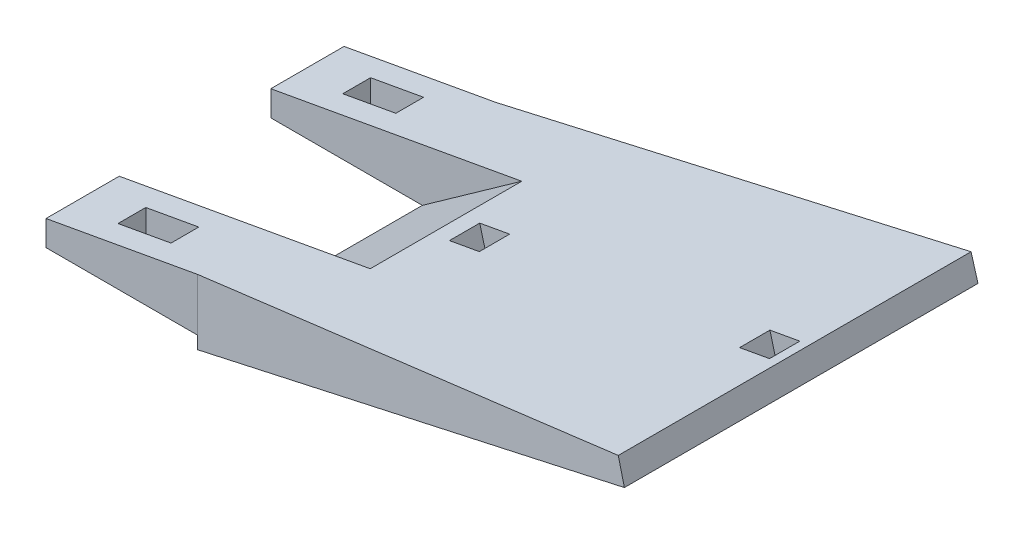
ISO-10303-21;
HEADER;
FILE_DESCRIPTION(('STEP AP214'),'2;1');
FILE_NAME('part.step','',(''),(''),'','','');
FILE_SCHEMA(('AUTOMOTIVE_DESIGN { 1 0 10303 214 1 1 1 1 }'));
ENDSEC;
DATA;
#1=APPLICATION_CONTEXT('core data for automotive mechanical design processes');
#2=APPLICATION_PROTOCOL_DEFINITION('international standard','automotive_design',2000,#1);
#3=PRODUCT_CONTEXT('',#1,'mechanical');
#4=PRODUCT('Part','Part','',(#3));
#5=PRODUCT_RELATED_PRODUCT_CATEGORY('part','',(#4));
#6=PRODUCT_DEFINITION_FORMATION('','',#4);
#7=PRODUCT_DEFINITION_CONTEXT('part definition',#1,'design');
#8=PRODUCT_DEFINITION('design','',#6,#7);
#9=PRODUCT_DEFINITION_SHAPE('','',#8);
#10=(LENGTH_UNIT() NAMED_UNIT(*) SI_UNIT(.MILLI.,.METRE.));
#11=(NAMED_UNIT(*) PLANE_ANGLE_UNIT() SI_UNIT($,.RADIAN.));
#12=(NAMED_UNIT(*) SI_UNIT($,.STERADIAN.) SOLID_ANGLE_UNIT());
#13=UNCERTAINTY_MEASURE_WITH_UNIT(LENGTH_MEASURE(1.E-05),#10,'distance_accuracy_value','');
#14=(GEOMETRIC_REPRESENTATION_CONTEXT(3) GLOBAL_UNCERTAINTY_ASSIGNED_CONTEXT((#13)) GLOBAL_UNIT_ASSIGNED_CONTEXT((#10,
#11,#12)) REPRESENTATION_CONTEXT('',''));
#15=CARTESIAN_POINT('',(0.,0.,0.));
#16=DIRECTION('',(0.,0.,1.));
#17=DIRECTION('',(1.,0.,0.));
#18=AXIS2_PLACEMENT_3D('',#15,#16,#17);
#19=CARTESIAN_POINT('',(88.7059047744874,28.9450564502461,70.));
#20=DIRECTION('',(0.177779236998913,-0.984070395292981,0.));
#21=DIRECTION('',(0.984070395292981,0.177779236998913,0.));
#22=AXIS2_PLACEMENT_3D('',#19,#20,#21);
#23=PLANE('',#22);
#24=DIRECTION('',(0.,0.,-1.));
#25=VECTOR('',#24,1.);
#26=CARTESIAN_POINT('',(-9.74999999999999,11.1583049001857,70.));
#27=LINE('',#26,#25);
#28=CARTESIAN_POINT('',(-9.74999999999999,11.1583049001857,60.));
#29=VERTEX_POINT('',#28);
#30=CARTESIAN_POINT('',(-9.74999999999999,11.1583049001857,54.5));
#31=VERTEX_POINT('',#30);
#32=EDGE_CURVE('E323',#29,#31,#27,.T.);
#33=ORIENTED_EDGE('',*,*,#32,.F.);
#34=DIRECTION('',(0.984070395292981,0.177779236998913,0.));
#35=VECTOR('',#34,1.);
#36=CARTESIAN_POINT('',(88.7059047744874,28.9450564502461,60.));
#37=LINE('',#36,#35);
#38=CARTESIAN_POINT('',(-20.25,9.26140606305237,60.));
#39=VERTEX_POINT('',#38);
#40=EDGE_CURVE('E308',#39,#29,#37,.T.);
#41=ORIENTED_EDGE('',*,*,#40,.F.);
#42=DIRECTION('',(0.,0.,-1.));
#43=VECTOR('',#42,1.);
#44=CARTESIAN_POINT('',(-20.25,9.26140606305237,70.));
#45=LINE('',#44,#43);
#46=CARTESIAN_POINT('',(-20.25,9.26140606305237,54.5));
#47=VERTEX_POINT('',#46);
#48=EDGE_CURVE('E317',#39,#47,#45,.T.);
#49=ORIENTED_EDGE('',*,*,#48,.T.);
#50=DIRECTION('',(0.984070395292981,0.177779236998913,0.));
#51=VECTOR('',#50,1.);
#52=CARTESIAN_POINT('',(88.7059047744874,28.9450564502461,54.5));
#53=LINE('',#52,#51);
#54=EDGE_CURVE('E320',#47,#31,#53,.T.);
#55=ORIENTED_EDGE('',*,*,#54,.T.);
#56=EDGE_LOOP('',(#33,#41,#49,#55));
#57=FACE_BOUND('',#56,.T.);
#58=DIRECTION('',(0.,0.,-1.));
#59=VECTOR('',#58,1.);
#60=CARTESIAN_POINT('',(-9.75000000000001,11.1583049001857,70.));
#61=LINE('',#60,#59);
#62=CARTESIAN_POINT('',(-9.75000000000001,11.1583049001857,15.5));
#63=VERTEX_POINT('',#62);
#64=CARTESIAN_POINT('',(-9.75000000000001,11.1583049001857,10.));
#65=VERTEX_POINT('',#64);
#66=EDGE_CURVE('E385',#63,#65,#61,.T.);
#67=ORIENTED_EDGE('',*,*,#66,.F.);
#68=DIRECTION('',(0.984070395292981,0.177779236998913,0.));
#69=VECTOR('',#68,1.);
#70=CARTESIAN_POINT('',(88.7059047744874,28.9450564502461,15.5));
#71=LINE('',#70,#69);
#72=CARTESIAN_POINT('',(-20.25,9.26140606305237,15.5));
#73=VERTEX_POINT('',#72);
#74=EDGE_CURVE('E370',#73,#63,#71,.T.);
#75=ORIENTED_EDGE('',*,*,#74,.F.);
#76=DIRECTION('',(0.,0.,-1.));
#77=VECTOR('',#76,1.);
#78=CARTESIAN_POINT('',(-20.25,9.26140606305237,70.));
#79=LINE('',#78,#77);
#80=CARTESIAN_POINT('',(-20.25,9.26140606305237,10.));
#81=VERTEX_POINT('',#80);
#82=EDGE_CURVE('E379',#73,#81,#79,.T.);
#83=ORIENTED_EDGE('',*,*,#82,.T.);
#84=DIRECTION('',(0.984070395292981,0.177779236998913,0.));
#85=VECTOR('',#84,1.);
#86=CARTESIAN_POINT('',(88.7059047744874,28.9450564502461,10.));
#87=LINE('',#86,#85);
#88=EDGE_CURVE('E382',#81,#65,#87,.T.);
#89=ORIENTED_EDGE('',*,*,#88,.T.);
#90=EDGE_LOOP('',(#67,#75,#83,#89));
#91=FACE_BOUND('',#90,.T.);
#92=DIRECTION('',(0.984070395292981,0.177779236998913,0.));
#93=VECTOR('',#92,1.);
#94=CARTESIAN_POINT('',(88.7059047744874,28.9450564502461,32.));
#95=LINE('',#94,#93);
#96=CARTESIAN_POINT('',(23.3598525678654,17.1398325986276,32.));
#97=VERTEX_POINT('',#96);
#98=CARTESIAN_POINT('',(29.2847058359419,18.2101990057133,32.));
#99=VERTEX_POINT('',#98);
#100=EDGE_CURVE('E298',#97,#99,#95,.T.);
#101=ORIENTED_EDGE('',*,*,#100,.T.);
#102=DIRECTION('',(0.,0.,1.));
#103=VECTOR('',#102,1.);
#104=CARTESIAN_POINT('',(29.2847058359419,18.2101990057133,70.));
#105=LINE('',#104,#103);
#106=CARTESIAN_POINT('',(29.2847058359419,18.2101990057133,38.));
#107=VERTEX_POINT('',#106);
#108=EDGE_CURVE('E301',#99,#107,#105,.T.);
#109=ORIENTED_EDGE('',*,*,#108,.T.);
#110=DIRECTION('',(-0.984070395292981,-0.177779236998913,0.));
#111=VECTOR('',#110,1.);
#112=CARTESIAN_POINT('',(88.7059047744874,28.9450564502461,38.));
#113=LINE('',#112,#111);
#114=CARTESIAN_POINT('',(23.3598525678654,17.1398325986276,38.));
#115=VERTEX_POINT('',#114);
#116=EDGE_CURVE('E286',#107,#115,#113,.T.);
#117=ORIENTED_EDGE('',*,*,#116,.T.);
#118=DIRECTION('',(0.,0.,-1.));
#119=VECTOR('',#118,1.);
#120=CARTESIAN_POINT('',(23.3598525678654,17.1398325986276,70.));
#121=LINE('',#120,#119);
#122=EDGE_CURVE('E295',#115,#97,#121,.T.);
#123=ORIENTED_EDGE('',*,*,#122,.T.);
#124=EDGE_LOOP('',(#101,#109,#117,#123));
#125=FACE_BOUND('',#124,.T.);
#126=DIRECTION('',(0.984070395292981,0.177779236998913,0.));
#127=VECTOR('',#126,1.);
#128=CARTESIAN_POINT('',(88.7059047744874,28.9450564502461,32.));
#129=LINE('',#128,#127);
#130=CARTESIAN_POINT('',(80.8061004170521,27.5179012407985,32.));
#131=VERTEX_POINT('',#130);
#132=CARTESIAN_POINT('',(86.7309536851286,28.5882676478842,32.));
#133=VERTEX_POINT('',#132);
#134=EDGE_CURVE('E266',#131,#133,#129,.T.);
#135=ORIENTED_EDGE('',*,*,#134,.T.);
#136=DIRECTION('',(0.,0.,1.));
#137=VECTOR('',#136,1.);
#138=CARTESIAN_POINT('',(86.7309536851286,28.5882676478842,70.));
#139=LINE('',#138,#137);
#140=CARTESIAN_POINT('',(86.7309536851286,28.5882676478842,38.));
#141=VERTEX_POINT('',#140);
#142=EDGE_CURVE('E269',#133,#141,#139,.T.);
#143=ORIENTED_EDGE('',*,*,#142,.T.);
#144=DIRECTION('',(-0.984070395292981,-0.177779236998913,0.));
#145=VECTOR('',#144,1.);
#146=CARTESIAN_POINT('',(88.7059047744874,28.9450564502461,38.));
#147=LINE('',#146,#145);
#148=CARTESIAN_POINT('',(80.8061004170521,27.5179012407985,38.));
#149=VERTEX_POINT('',#148);
#150=EDGE_CURVE('E256',#141,#149,#147,.T.);
#151=ORIENTED_EDGE('',*,*,#150,.T.);
#152=DIRECTION('',(0.,0.,-1.));
#153=VECTOR('',#152,1.);
#154=CARTESIAN_POINT('',(80.8061004170521,27.5179012407985,70.));
#155=LINE('',#154,#153);
#156=EDGE_CURVE('E263',#149,#131,#155,.T.);
#157=ORIENTED_EDGE('',*,*,#156,.T.);
#158=EDGE_LOOP('',(#135,#143,#151,#157));
#159=FACE_BOUND('',#158,.T.);
#160=DIRECTION('',(0.,0.,-1.));
#161=VECTOR('',#160,1.);
#162=CARTESIAN_POINT('',(19.6814079058596,16.4752957032163,50.));
#163=LINE('',#162,#161);
#164=CARTESIAN_POINT('',(19.6814079058596,16.4752957032163,50.));
#165=VERTEX_POINT('',#164);
#166=CARTESIAN_POINT('',(19.6814079058596,16.4752957032163,20.));
#167=VERTEX_POINT('',#166);
#168=EDGE_CURVE('E216',#165,#167,#163,.T.);
#169=ORIENTED_EDGE('',*,*,#168,.F.);
#170=DIRECTION('',(0.984070395292981,0.177779236998913,0.));
#171=VECTOR('',#170,1.);
#172=CARTESIAN_POINT('',(88.7059047744874,28.9450564502461,50.));
#173=LINE('',#172,#171);
#174=CARTESIAN_POINT('',(-30.,7.5,50.));
#175=VERTEX_POINT('',#174);
#176=EDGE_CURVE('E223',#175,#165,#173,.T.);
#177=ORIENTED_EDGE('',*,*,#176,.F.);
#178=DIRECTION('',(0.,0.,-1.));
#179=VECTOR('',#178,1.);
#180=CARTESIAN_POINT('',(-30.,7.5,70.));
#181=LINE('',#180,#179);
#182=CARTESIAN_POINT('',(-30.,7.5,64.5));
#183=VERTEX_POINT('',#182);
#184=EDGE_CURVE('E399',#183,#175,#181,.T.);
#185=ORIENTED_EDGE('',*,*,#184,.F.);
#186=DIRECTION('',(0.984070395292981,0.177779236998913,0.));
#187=VECTOR('',#186,1.);
#188=CARTESIAN_POINT('',(88.7059047744874,28.9450564502461,64.5000000000001));
#189=LINE('',#188,#187);
#190=CARTESIAN_POINT('',(0.,12.9197109632381,64.5));
#191=VERTEX_POINT('',#190);
#192=EDGE_CURVE('E342',#183,#191,#189,.T.);
#193=ORIENTED_EDGE('',*,*,#192,.T.);
#194=DIRECTION('',(0.982295744809391,0.177458633909519,0.0600291844050182));
#195=VECTOR('',#194,1.);
#196=CARTESIAN_POINT('',(88.7105680504894,28.9458989038485,69.9212013808633));
#197=LINE('',#196,#195);
#198=CARTESIAN_POINT('',(88.7059047744874,28.9450564502461,69.9209164028854));
#199=VERTEX_POINT('',#198);
#200=EDGE_CURVE('E336',#191,#199,#197,.T.);
#201=ORIENTED_EDGE('',*,*,#200,.T.);
#202=DIRECTION('',(0.,0.,-1.));
#203=VECTOR('',#202,1.);
#204=CARTESIAN_POINT('',(88.7059047744874,28.9450564502461,70.));
#205=LINE('',#204,#203);
#206=CARTESIAN_POINT('',(88.7059047744874,28.9450564502461,0.0790835971146574));
#207=VERTEX_POINT('',#206);
#208=EDGE_CURVE('E401',#199,#207,#205,.T.);
#209=ORIENTED_EDGE('',*,*,#208,.T.);
#210=DIRECTION('',(-0.982295744809391,-0.177458633909519,0.0600291844050184));
#211=VECTOR('',#210,1.);
#212=CARTESIAN_POINT('',(84.5829191821094,28.2002101097033,0.331043827759989));
#213=LINE('',#212,#211);
#214=CARTESIAN_POINT('',(0.,12.9197109632381,5.50000000000002));
#215=VERTEX_POINT('',#214);
#216=EDGE_CURVE('E358',#207,#215,#213,.T.);
#217=ORIENTED_EDGE('',*,*,#216,.T.);
#218=DIRECTION('',(-0.984070395292981,-0.177779236998913,0.));
#219=VECTOR('',#218,1.);
#220=CARTESIAN_POINT('',(88.7059047744874,28.9450564502461,5.50000000000003));
#221=LINE('',#220,#219);
#222=CARTESIAN_POINT('',(-30.,7.5,5.5));
#223=VERTEX_POINT('',#222);
#224=EDGE_CURVE('E364',#215,#223,#221,.T.);
#225=ORIENTED_EDGE('',*,*,#224,.T.);
#226=CARTESIAN_POINT('',(-30.,7.5,20.));
#227=VERTEX_POINT('',#226);
#228=EDGE_CURVE('E219',#227,#223,#181,.T.);
#229=ORIENTED_EDGE('',*,*,#228,.F.);
#230=DIRECTION('',(0.984070395292981,0.177779236998913,0.));
#231=VECTOR('',#230,1.);
#232=CARTESIAN_POINT('',(88.7059047744874,28.9450564502461,20.));
#233=LINE('',#232,#231);
#234=EDGE_CURVE('E213',#227,#167,#233,.T.);
#235=ORIENTED_EDGE('',*,*,#234,.T.);
#236=EDGE_LOOP('',(#169,#177,#185,#193,#201,#209,#217,#225,#229,#235));
#237=FACE_BOUND('',#236,.T.);
#238=ADVANCED_FACE('F33',(#57,#91,#125,#159,#237),#23,.F.);
#239=CARTESIAN_POINT('',(0.,2.5,70.));
#240=DIRECTION('',(0.,1.,0.));
#241=DIRECTION('',(-1.,0.,0.));
#242=AXIS2_PLACEMENT_3D('',#239,#240,#241);
#243=PLANE('',#242);
#244=DIRECTION('',(0.,0.,-1.));
#245=VECTOR('',#244,1.);
#246=CARTESIAN_POINT('',(0.,2.5,70.));
#247=LINE('',#246,#245);
#248=CARTESIAN_POINT('',(0.,2.5,64.5));
#249=VERTEX_POINT('',#248);
#250=CARTESIAN_POINT('',(0.,2.5,50.));
#251=VERTEX_POINT('',#250);
#252=EDGE_CURVE('E393',#249,#251,#247,.T.);
#253=ORIENTED_EDGE('',*,*,#252,.F.);
#254=DIRECTION('',(-1.,0.,0.));
#255=VECTOR('',#254,1.);
#256=CARTESIAN_POINT('',(0.,2.5,64.5));
#257=LINE('',#256,#255);
#258=CARTESIAN_POINT('',(-30.,2.5,64.5));
#259=VERTEX_POINT('',#258);
#260=EDGE_CURVE('E339',#249,#259,#257,.T.);
#261=ORIENTED_EDGE('',*,*,#260,.T.);
#262=DIRECTION('',(0.,0.,-1.));
#263=VECTOR('',#262,1.);
#264=CARTESIAN_POINT('',(-30.,2.5,70.));
#265=LINE('',#264,#263);
#266=CARTESIAN_POINT('',(-30.,2.5,50.));
#267=VERTEX_POINT('',#266);
#268=EDGE_CURVE('E397',#259,#267,#265,.T.);
#269=ORIENTED_EDGE('',*,*,#268,.T.);
#270=DIRECTION('',(-1.,0.,0.));
#271=VECTOR('',#270,1.);
#272=CARTESIAN_POINT('',(0.,2.5,50.));
#273=LINE('',#272,#271);
#274=EDGE_CURVE('E409',#251,#267,#273,.T.);
#275=ORIENTED_EDGE('',*,*,#274,.F.);
#276=EDGE_LOOP('',(#253,#261,#269,#275));
#277=FACE_BOUND('',#276,.T.);
#278=DIRECTION('',(0.,0.,1.));
#279=VECTOR('',#278,1.);
#280=CARTESIAN_POINT('',(-9.74999999999999,2.5,70.));
#281=LINE('',#280,#279);
#282=CARTESIAN_POINT('',(-9.74999999999999,2.5,54.5));
#283=VERTEX_POINT('',#282);
#284=CARTESIAN_POINT('',(-9.74999999999999,2.5,60.));
#285=VERTEX_POINT('',#284);
#286=EDGE_CURVE('E11',#283,#285,#281,.T.);
#287=ORIENTED_EDGE('',*,*,#286,.F.);
#288=DIRECTION('',(-1.,0.,0.));
#289=VECTOR('',#288,1.);
#290=CARTESIAN_POINT('',(0.,2.5,54.5));
#291=LINE('',#290,#289);
#292=CARTESIAN_POINT('',(-20.25,2.5,54.5));
#293=VERTEX_POINT('',#292);
#294=EDGE_CURVE('E41',#283,#293,#291,.T.);
#295=ORIENTED_EDGE('',*,*,#294,.T.);
#296=DIRECTION('',(0.,0.,1.));
#297=VECTOR('',#296,1.);
#298=CARTESIAN_POINT('',(-20.25,2.5,70.));
#299=LINE('',#298,#297);
#300=CARTESIAN_POINT('',(-20.25,2.5,60.));
#301=VERTEX_POINT('',#300);
#302=EDGE_CURVE('E425',#293,#301,#299,.T.);
#303=ORIENTED_EDGE('',*,*,#302,.T.);
#304=DIRECTION('',(-1.,0.,0.));
#305=VECTOR('',#304,1.);
#306=CARTESIAN_POINT('',(0.,2.5,60.));
#307=LINE('',#306,#305);
#308=EDGE_CURVE('E423',#285,#301,#307,.T.);
#309=ORIENTED_EDGE('',*,*,#308,.F.);
#310=EDGE_LOOP('',(#287,#295,#303,#309));
#311=FACE_BOUND('',#310,.T.);
#312=ADVANCED_FACE('F430',(#277,#311),#243,.F.);
#313=CARTESIAN_POINT('',(-30.,2.5,20.));
#314=VERTEX_POINT('',#313);
#315=CARTESIAN_POINT('',(-30.,2.5,5.49999999999999));
#316=VERTEX_POINT('',#315);
#317=EDGE_CURVE('E396',#314,#316,#265,.T.);
#318=ORIENTED_EDGE('',*,*,#317,.T.);
#319=DIRECTION('',(1.,0.,0.));
#320=VECTOR('',#319,1.);
#321=CARTESIAN_POINT('',(0.,2.5,5.50000000000001));
#322=LINE('',#321,#320);
#323=CARTESIAN_POINT('',(0.,2.5,5.50000000000001));
#324=VERTEX_POINT('',#323);
#325=EDGE_CURVE('E361',#316,#324,#322,.T.);
#326=ORIENTED_EDGE('',*,*,#325,.T.);
#327=CARTESIAN_POINT('',(0.,2.5,20.));
#328=VERTEX_POINT('',#327);
#329=EDGE_CURVE('E392',#328,#324,#247,.T.);
#330=ORIENTED_EDGE('',*,*,#329,.F.);
#331=DIRECTION('',(-1.,0.,0.));
#332=VECTOR('',#331,1.);
#333=CARTESIAN_POINT('',(0.,2.5,20.));
#334=LINE('',#333,#332);
#335=EDGE_CURVE('E238',#328,#314,#334,.T.);
#336=ORIENTED_EDGE('',*,*,#335,.T.);
#337=EDGE_LOOP('',(#318,#326,#330,#336));
#338=FACE_BOUND('',#337,.T.);
#339=DIRECTION('',(0.,0.,1.));
#340=VECTOR('',#339,1.);
#341=CARTESIAN_POINT('',(-9.75,2.5,70.));
#342=LINE('',#341,#340);
#343=CARTESIAN_POINT('',(-9.75,2.5,10.));
#344=VERTEX_POINT('',#343);
#345=CARTESIAN_POINT('',(-9.75,2.5,15.5));
#346=VERTEX_POINT('',#345);
#347=EDGE_CURVE('E420',#344,#346,#342,.T.);
#348=ORIENTED_EDGE('',*,*,#347,.F.);
#349=DIRECTION('',(-1.,0.,0.));
#350=VECTOR('',#349,1.);
#351=CARTESIAN_POINT('',(0.,2.5,10.));
#352=LINE('',#351,#350);
#353=CARTESIAN_POINT('',(-20.25,2.5,10.));
#354=VERTEX_POINT('',#353);
#355=EDGE_CURVE('E417',#344,#354,#352,.T.);
#356=ORIENTED_EDGE('',*,*,#355,.T.);
#357=DIRECTION('',(0.,0.,1.));
#358=VECTOR('',#357,1.);
#359=CARTESIAN_POINT('',(-20.25,2.5,70.));
#360=LINE('',#359,#358);
#361=CARTESIAN_POINT('',(-20.25,2.5,15.5));
#362=VERTEX_POINT('',#361);
#363=EDGE_CURVE('E414',#354,#362,#360,.T.);
#364=ORIENTED_EDGE('',*,*,#363,.T.);
#365=DIRECTION('',(-1.,0.,0.));
#366=VECTOR('',#365,1.);
#367=CARTESIAN_POINT('',(0.,2.5,15.5));
#368=LINE('',#367,#366);
#369=EDGE_CURVE('E412',#346,#362,#368,.T.);
#370=ORIENTED_EDGE('',*,*,#369,.F.);
#371=EDGE_LOOP('',(#348,#356,#364,#370));
#372=FACE_BOUND('',#371,.T.);
#373=ADVANCED_FACE('F465',(#338,#372),#243,.F.);
#374=CARTESIAN_POINT('',(-30.,2.5,70.));
#375=DIRECTION('',(1.,0.,0.));
#376=DIRECTION('',(0.,0.,-1.));
#377=AXIS2_PLACEMENT_3D('',#374,#375,#376);
#378=PLANE('',#377);
#379=ORIENTED_EDGE('',*,*,#268,.F.);
#380=DIRECTION('',(0.,-1.,0.));
#381=VECTOR('',#380,1.);
#382=CARTESIAN_POINT('',(-30.,28.9450564502461,64.5));
#383=LINE('',#382,#381);
#384=EDGE_CURVE('E325',#183,#259,#383,.T.);
#385=ORIENTED_EDGE('',*,*,#384,.F.);
#386=ORIENTED_EDGE('',*,*,#184,.T.);
#387=DIRECTION('',(0.,-1.,0.));
#388=VECTOR('',#387,1.);
#389=CARTESIAN_POINT('',(-30.,28.9450564502461,50.));
#390=LINE('',#389,#388);
#391=EDGE_CURVE('E224',#175,#267,#390,.T.);
#392=ORIENTED_EDGE('',*,*,#391,.T.);
#393=EDGE_LOOP('',(#379,#385,#386,#392));
#394=FACE_BOUND('',#393,.T.);
#395=ADVANCED_FACE('F480',(#394),#378,.F.);
#396=CARTESIAN_POINT('',(0.,0.,70.));
#397=DIRECTION('',(1.,0.,0.));
#398=DIRECTION('',(0.,0.,-1.));
#399=AXIS2_PLACEMENT_3D('',#396,#397,#398);
#400=PLANE('',#399);
#401=ORIENTED_EDGE('',*,*,#252,.T.);
#402=DIRECTION('',(0.,0.,-1.));
#403=VECTOR('',#402,1.);
#404=CARTESIAN_POINT('',(0.,2.5,50.));
#405=LINE('',#404,#403);
#406=EDGE_CURVE('E233',#251,#328,#405,.T.);
#407=ORIENTED_EDGE('',*,*,#406,.T.);
#408=ORIENTED_EDGE('',*,*,#329,.T.);
#409=DIRECTION('',(0.,-1.,0.));
#410=VECTOR('',#409,1.);
#411=CARTESIAN_POINT('',(0.,28.9450564502461,5.50000000000001));
#412=LINE('',#411,#410);
#413=CARTESIAN_POINT('',(0.,0.,5.50000000000001));
#414=VERTEX_POINT('',#413);
#415=EDGE_CURVE('E345',#324,#414,#412,.T.);
#416=ORIENTED_EDGE('',*,*,#415,.T.);
#417=DIRECTION('',(0.,0.,-1.));
#418=VECTOR('',#417,1.);
#419=CARTESIAN_POINT('',(0.,0.,70.));
#420=LINE('',#419,#418);
#421=CARTESIAN_POINT('',(0.,0.,64.5));
#422=VERTEX_POINT('',#421);
#423=EDGE_CURVE('E406',#422,#414,#420,.T.);
#424=ORIENTED_EDGE('',*,*,#423,.F.);
#425=DIRECTION('',(0.,-1.,0.));
#426=VECTOR('',#425,1.);
#427=CARTESIAN_POINT('',(0.,28.9450564502461,64.5));
#428=LINE('',#427,#426);
#429=EDGE_CURVE('E326',#249,#422,#428,.T.);
#430=ORIENTED_EDGE('',*,*,#429,.F.);
#431=EDGE_LOOP('',(#401,#407,#408,#416,#424,#430));
#432=FACE_BOUND('',#431,.T.);
#433=ADVANCED_FACE('F35',(#432),#400,.F.);
#434=CARTESIAN_POINT('',(0.,0.,70.));
#435=DIRECTION('',(-0.258819045102518,0.965925826289069,0.));
#436=DIRECTION('',(-0.965925826289069,-0.258819045102518,0.));
#437=AXIS2_PLACEMENT_3D('',#434,#435,#436);
#438=PLANE('',#437);
#439=DIRECTION('',(-0.965925826289069,-0.258819045102518,0.));
#440=VECTOR('',#439,1.);
#441=CARTESIAN_POINT('',(82.2725933896875,22.0448749579806,38.));
#442=LINE('',#441,#440);
#443=CARTESIAN_POINT('',(88.0681483474219,23.5977892285957,38.));
#444=VERTEX_POINT('',#443);
#445=CARTESIAN_POINT('',(82.2725933896875,22.0448749579806,38.));
#446=VERTEX_POINT('',#445);
#447=EDGE_CURVE('E245',#444,#446,#442,.T.);
#448=ORIENTED_EDGE('',*,*,#447,.F.);
#449=DIRECTION('',(0.,0.,1.));
#450=VECTOR('',#449,1.);
#451=CARTESIAN_POINT('',(88.0681483474219,23.5977892285957,38.));
#452=LINE('',#451,#450);
#453=CARTESIAN_POINT('',(88.0681483474219,23.5977892285957,32.));
#454=VERTEX_POINT('',#453);
#455=EDGE_CURVE('E56',#454,#444,#452,.T.);
#456=ORIENTED_EDGE('',*,*,#455,.F.);
#457=DIRECTION('',(0.965925826289069,0.258819045102518,0.));
#458=VECTOR('',#457,1.);
#459=CARTESIAN_POINT('',(82.2725933896875,22.0448749579806,32.));
#460=LINE('',#459,#458);
#461=CARTESIAN_POINT('',(82.2725933896875,22.0448749579806,32.));
#462=VERTEX_POINT('',#461);
#463=EDGE_CURVE('E250',#462,#454,#460,.T.);
#464=ORIENTED_EDGE('',*,*,#463,.F.);
#465=DIRECTION('',(0.,0.,-1.));
#466=VECTOR('',#465,1.);
#467=CARTESIAN_POINT('',(82.2725933896875,22.0448749579806,38.));
#468=LINE('',#467,#466);
#469=EDGE_CURVE('E247',#446,#462,#468,.T.);
#470=ORIENTED_EDGE('',*,*,#469,.F.);
#471=EDGE_LOOP('',(#448,#456,#464,#470));
#472=FACE_BOUND('',#471,.T.);
#473=DIRECTION('',(-0.965925826289069,-0.258819045102518,0.));
#474=VECTOR('',#473,1.);
#475=CARTESIAN_POINT('',(26.0799973098049,6.98811421776798,38.));
#476=LINE('',#475,#474);
#477=CARTESIAN_POINT('',(31.8755522675393,8.54102848838309,38.));
#478=VERTEX_POINT('',#477);
#479=CARTESIAN_POINT('',(26.0799973098049,6.98811421776798,38.));
#480=VERTEX_POINT('',#479);
#481=EDGE_CURVE('E274',#478,#480,#476,.T.);
#482=ORIENTED_EDGE('',*,*,#481,.F.);
#483=DIRECTION('',(0.,0.,1.));
#484=VECTOR('',#483,1.);
#485=CARTESIAN_POINT('',(31.8755522675393,8.54102848838309,38.));
#486=LINE('',#485,#484);
#487=CARTESIAN_POINT('',(31.8755522675393,8.54102848838309,32.));
#488=VERTEX_POINT('',#487);
#489=EDGE_CURVE('E272',#488,#478,#486,.T.);
#490=ORIENTED_EDGE('',*,*,#489,.F.);
#491=DIRECTION('',(0.965925826289069,0.258819045102518,0.));
#492=VECTOR('',#491,1.);
#493=CARTESIAN_POINT('',(26.0799973098049,6.98811421776798,32.));
#494=LINE('',#493,#492);
#495=CARTESIAN_POINT('',(26.0799973098049,6.98811421776798,32.));
#496=VERTEX_POINT('',#495);
#497=EDGE_CURVE('E280',#496,#488,#494,.T.);
#498=ORIENTED_EDGE('',*,*,#497,.F.);
#499=DIRECTION('',(0.,0.,-1.));
#500=VECTOR('',#499,1.);
#501=CARTESIAN_POINT('',(26.0799973098049,6.98811421776798,38.));
#502=LINE('',#501,#500);
#503=EDGE_CURVE('E277',#480,#496,#502,.T.);
#504=ORIENTED_EDGE('',*,*,#503,.F.);
#505=EDGE_LOOP('',(#482,#490,#498,#504));
#506=FACE_BOUND('',#505,.T.);
#507=DIRECTION('',(0.,0.,-1.));
#508=VECTOR('',#507,1.);
#509=CARTESIAN_POINT('',(90.,24.1154273188008,70.));
#510=LINE('',#509,#508);
#511=CARTESIAN_POINT('',(90.,24.1154273188008,70.));
#512=VERTEX_POINT('',#511);
#513=CARTESIAN_POINT('',(90.,24.1154273188008,0.));
#514=VERTEX_POINT('',#513);
#515=EDGE_CURVE('E403',#512,#514,#510,.T.);
#516=ORIENTED_EDGE('',*,*,#515,.F.);
#517=DIRECTION('',(-0.964247375681069,-0.258369305617569,-0.058926228513843));
#518=VECTOR('',#517,1.);
#519=CARTESIAN_POINT('',(0.312507036617908,0.0837360080908107,64.5190976522378));
#520=LINE('',#519,#518);
#521=EDGE_CURVE('E333',#512,#422,#520,.T.);
#522=ORIENTED_EDGE('',*,*,#521,.T.);
#523=ORIENTED_EDGE('',*,*,#423,.T.);
#524=DIRECTION('',(0.964247375681069,0.258369305617569,-0.0589262285138432));
#525=VECTOR('',#524,1.);
#526=CARTESIAN_POINT('',(-3.66485524761003,-0.98199500397406,5.72396337624287));
#527=LINE('',#526,#525);
#528=EDGE_CURVE('E355',#414,#514,#527,.T.);
#529=ORIENTED_EDGE('',*,*,#528,.T.);
#530=EDGE_LOOP('',(#516,#522,#523,#529));
#531=FACE_BOUND('',#530,.T.);
#532=ADVANCED_FACE('F473',(#472,#506,#531),#438,.F.);
#533=CARTESIAN_POINT('',(90.,24.1154273188008,70.));
#534=DIRECTION('',(-0.965925826289069,-0.258819045102518,0.));
#535=DIRECTION('',(0.258819045102518,-0.965925826289069,0.));
#536=AXIS2_PLACEMENT_3D('',#533,#534,#535);
#537=PLANE('',#536);
#538=ORIENTED_EDGE('',*,*,#208,.F.);
#539=DIRECTION('',(0.258786676974704,-0.96580502679152,0.0158147413706763));
#540=VECTOR('',#539,1.);
#541=CARTESIAN_POINT('',(90.,24.1154273188008,70.));
#542=LINE('',#541,#540);
#543=EDGE_CURVE('E330',#199,#512,#542,.T.);
#544=ORIENTED_EDGE('',*,*,#543,.T.);
#545=ORIENTED_EDGE('',*,*,#515,.T.);
#546=DIRECTION('',(-0.258786676974704,0.96580502679152,0.0158147413706764));
#547=VECTOR('',#546,1.);
#548=CARTESIAN_POINT('',(89.7135148943428,25.1846042887253,0.0175074231235084));
#549=LINE('',#548,#547);
#550=EDGE_CURVE('E349',#514,#207,#549,.T.);
#551=ORIENTED_EDGE('',*,*,#550,.T.);
#552=EDGE_LOOP('',(#538,#544,#545,#551));
#553=FACE_BOUND('',#552,.T.);
#554=ADVANCED_FACE('F471',(#553),#537,.F.);
#555=ORIENTED_EDGE('',*,*,#228,.T.);
#556=DIRECTION('',(0.,-1.,0.));
#557=VECTOR('',#556,1.);
#558=CARTESIAN_POINT('',(-30.,28.9450564502461,5.5));
#559=LINE('',#558,#557);
#560=EDGE_CURVE('E346',#223,#316,#559,.T.);
#561=ORIENTED_EDGE('',*,*,#560,.T.);
#562=ORIENTED_EDGE('',*,*,#317,.F.);
#563=DIRECTION('',(0.,-1.,0.));
#564=VECTOR('',#563,1.);
#565=CARTESIAN_POINT('',(-30.,28.9450564502461,20.));
#566=LINE('',#565,#564);
#567=EDGE_CURVE('E387',#227,#314,#566,.T.);
#568=ORIENTED_EDGE('',*,*,#567,.F.);
#569=EDGE_LOOP('',(#555,#561,#562,#568));
#570=FACE_BOUND('',#569,.T.);
#571=ADVANCED_FACE('F470',(#570),#378,.F.);
#572=CARTESIAN_POINT('',(0.,28.9450564502461,50.));
#573=DIRECTION('',(0.,0.,-1.));
#574=DIRECTION('',(-1.,0.,0.));
#575=AXIS2_PLACEMENT_3D('',#572,#573,#574);
#576=PLANE('',#575);
#577=ORIENTED_EDGE('',*,*,#176,.T.);
#578=DIRECTION('',(-0.815353726614054,-0.578963125334052,0.));
#579=VECTOR('',#578,1.);
#580=CARTESIAN_POINT('',(19.6814079058596,16.4752957032163,50.));
#581=LINE('',#580,#579);
#582=EDGE_CURVE('E232',#165,#251,#581,.T.);
#583=ORIENTED_EDGE('',*,*,#582,.T.);
#584=ORIENTED_EDGE('',*,*,#274,.T.);
#585=ORIENTED_EDGE('',*,*,#391,.F.);
#586=EDGE_LOOP('',(#577,#583,#584,#585));
#587=FACE_BOUND('',#586,.T.);
#588=ADVANCED_FACE('F508',(#587),#576,.T.);
#589=CARTESIAN_POINT('',(0.,28.9450564502461,20.));
#590=DIRECTION('',(0.,0.,-1.));
#591=DIRECTION('',(-1.,0.,0.));
#592=AXIS2_PLACEMENT_3D('',#589,#590,#591);
#593=PLANE('',#592);
#594=ORIENTED_EDGE('',*,*,#567,.T.);
#595=ORIENTED_EDGE('',*,*,#335,.F.);
#596=DIRECTION('',(-0.815353726614054,-0.578963125334052,0.));
#597=VECTOR('',#596,1.);
#598=CARTESIAN_POINT('',(19.6814079058596,16.4752957032163,20.));
#599=LINE('',#598,#597);
#600=EDGE_CURVE('E229',#167,#328,#599,.T.);
#601=ORIENTED_EDGE('',*,*,#600,.F.);
#602=ORIENTED_EDGE('',*,*,#234,.F.);
#603=EDGE_LOOP('',(#594,#595,#601,#602));
#604=FACE_BOUND('',#603,.T.);
#605=ADVANCED_FACE('F236',(#604),#593,.F.);
#606=CARTESIAN_POINT('',(-9.75000000000001,28.9450564502461,0.));
#607=DIRECTION('',(-1.,0.,0.));
#608=DIRECTION('',(0.,-1.,0.));
#609=AXIS2_PLACEMENT_3D('',#606,#607,#608);
#610=PLANE('',#609);
#611=ORIENTED_EDGE('',*,*,#66,.T.);
#612=DIRECTION('',(0.,-1.,0.));
#613=VECTOR('',#612,1.);
#614=CARTESIAN_POINT('',(-9.75000000000001,28.9450564502461,10.));
#615=LINE('',#614,#613);
#616=EDGE_CURVE('E367',#65,#344,#615,.T.);
#617=ORIENTED_EDGE('',*,*,#616,.T.);
#618=ORIENTED_EDGE('',*,*,#347,.T.);
#619=DIRECTION('',(0.,-1.,0.));
#620=VECTOR('',#619,1.);
#621=CARTESIAN_POINT('',(-9.75000000000001,28.9450564502461,15.5));
#622=LINE('',#621,#620);
#623=EDGE_CURVE('E366',#63,#346,#622,.T.);
#624=ORIENTED_EDGE('',*,*,#623,.F.);
#625=EDGE_LOOP('',(#611,#617,#618,#624));
#626=FACE_BOUND('',#625,.T.);
#627=ADVANCED_FACE('F539',(#626),#610,.T.);
#628=CARTESIAN_POINT('',(0.,28.9450564502461,10.));
#629=DIRECTION('',(0.,0.,-1.));
#630=DIRECTION('',(-1.,0.,0.));
#631=AXIS2_PLACEMENT_3D('',#628,#629,#630);
#632=PLANE('',#631);
#633=DIRECTION('',(0.,-1.,0.));
#634=VECTOR('',#633,1.);
#635=CARTESIAN_POINT('',(-20.25,28.9450564502461,10.));
#636=LINE('',#635,#634);
#637=EDGE_CURVE('E371',#81,#354,#636,.T.);
#638=ORIENTED_EDGE('',*,*,#637,.T.);
#639=ORIENTED_EDGE('',*,*,#355,.F.);
#640=ORIENTED_EDGE('',*,*,#616,.F.);
#641=ORIENTED_EDGE('',*,*,#88,.F.);
#642=EDGE_LOOP('',(#638,#639,#640,#641));
#643=FACE_BOUND('',#642,.T.);
#644=ADVANCED_FACE('F536',(#643),#632,.F.);
#645=CARTESIAN_POINT('',(-20.25,28.9450564502461,0.));
#646=DIRECTION('',(-1.,0.,0.));
#647=DIRECTION('',(0.,-1.,0.));
#648=AXIS2_PLACEMENT_3D('',#645,#646,#647);
#649=PLANE('',#648);
#650=DIRECTION('',(0.,-1.,0.));
#651=VECTOR('',#650,1.);
#652=CARTESIAN_POINT('',(-20.25,28.9450564502461,15.5));
#653=LINE('',#652,#651);
#654=EDGE_CURVE('E374',#73,#362,#653,.T.);
#655=ORIENTED_EDGE('',*,*,#654,.T.);
#656=ORIENTED_EDGE('',*,*,#363,.F.);
#657=ORIENTED_EDGE('',*,*,#637,.F.);
#658=ORIENTED_EDGE('',*,*,#82,.F.);
#659=EDGE_LOOP('',(#655,#656,#657,#658));
#660=FACE_BOUND('',#659,.T.);
#661=ADVANCED_FACE('F530',(#660),#649,.F.);
#662=CARTESIAN_POINT('',(0.,28.9450564502461,15.5));
#663=DIRECTION('',(0.,0.,-1.));
#664=DIRECTION('',(-1.,0.,0.));
#665=AXIS2_PLACEMENT_3D('',#662,#663,#664);
#666=PLANE('',#665);
#667=ORIENTED_EDGE('',*,*,#74,.T.);
#668=ORIENTED_EDGE('',*,*,#623,.T.);
#669=ORIENTED_EDGE('',*,*,#369,.T.);
#670=ORIENTED_EDGE('',*,*,#654,.F.);
#671=EDGE_LOOP('',(#667,#668,#669,#670));
#672=FACE_BOUND('',#671,.T.);
#673=ADVANCED_FACE('F523',(#672),#666,.T.);
#674=CARTESIAN_POINT('',(0.,28.9450564502461,5.50000000000001));
#675=DIRECTION('',(0.,0.,1.));
#676=DIRECTION('',(1.,0.,0.));
#677=AXIS2_PLACEMENT_3D('',#674,#675,#676);
#678=PLANE('',#677);
#679=EDGE_CURVE('E350',#215,#324,#412,.T.);
#680=ORIENTED_EDGE('',*,*,#679,.T.);
#681=ORIENTED_EDGE('',*,*,#325,.F.);
#682=ORIENTED_EDGE('',*,*,#560,.F.);
#683=ORIENTED_EDGE('',*,*,#224,.F.);
#684=EDGE_LOOP('',(#680,#681,#682,#683));
#685=FACE_BOUND('',#684,.T.);
#686=ADVANCED_FACE('F521',(#685),#678,.F.);
#687=CARTESIAN_POINT('',(0.334860551643551,28.9450564502461,5.47953629962179));
#688=DIRECTION('',(0.0609973179413611,0.,0.998137929949544));
#689=DIRECTION('',(0.998137929949544,0.,-0.0609973179413611));
#690=AXIS2_PLACEMENT_3D('',#687,#688,#689);
#691=PLANE('',#690);
#692=ORIENTED_EDGE('',*,*,#550,.F.);
#693=ORIENTED_EDGE('',*,*,#528,.F.);
#694=ORIENTED_EDGE('',*,*,#415,.F.);
#695=ORIENTED_EDGE('',*,*,#679,.F.);
#696=ORIENTED_EDGE('',*,*,#216,.F.);
#697=EDGE_LOOP('',(#692,#693,#694,#695,#696));
#698=FACE_BOUND('',#697,.T.);
#699=ADVANCED_FACE('F512',(#698),#691,.F.);
#700=CARTESIAN_POINT('',(0.,28.9450564502461,64.5));
#701=DIRECTION('',(0.,0.,-1.));
#702=DIRECTION('',(-1.,0.,0.));
#703=AXIS2_PLACEMENT_3D('',#700,#701,#702);
#704=PLANE('',#703);
#705=ORIENTED_EDGE('',*,*,#384,.T.);
#706=ORIENTED_EDGE('',*,*,#260,.F.);
#707=EDGE_CURVE('E328',#191,#249,#428,.T.);
#708=ORIENTED_EDGE('',*,*,#707,.F.);
#709=ORIENTED_EDGE('',*,*,#192,.F.);
#710=EDGE_LOOP('',(#705,#706,#708,#709));
#711=FACE_BOUND('',#710,.T.);
#712=ADVANCED_FACE('F501',(#711),#704,.F.);
#713=CARTESIAN_POINT('',(-3.92700101472894,28.9450564502461,64.2600166046555));
#714=DIRECTION('',(0.0609973179413609,0.,-0.998137929949544));
#715=DIRECTION('',(-0.998137929949544,0.,-0.0609973179413609));
#716=AXIS2_PLACEMENT_3D('',#713,#714,#715);
#717=PLANE('',#716);
#718=ORIENTED_EDGE('',*,*,#707,.T.);
#719=ORIENTED_EDGE('',*,*,#429,.T.);
#720=ORIENTED_EDGE('',*,*,#521,.F.);
#721=ORIENTED_EDGE('',*,*,#543,.F.);
#722=ORIENTED_EDGE('',*,*,#200,.F.);
#723=EDGE_LOOP('',(#718,#719,#720,#721,#722));
#724=FACE_BOUND('',#723,.T.);
#725=ADVANCED_FACE('F495',(#724),#717,.F.);
#726=CARTESIAN_POINT('',(-9.74999999999999,28.9450564502461,0.));
#727=DIRECTION('',(-1.,0.,0.));
#728=DIRECTION('',(0.,-1.,0.));
#729=AXIS2_PLACEMENT_3D('',#726,#727,#728);
#730=PLANE('',#729);
#731=ORIENTED_EDGE('',*,*,#32,.T.);
#732=DIRECTION('',(0.,-1.,0.));
#733=VECTOR('',#732,1.);
#734=CARTESIAN_POINT('',(-9.74999999999999,28.9450564502461,54.5));
#735=LINE('',#734,#733);
#736=EDGE_CURVE('E305',#31,#283,#735,.T.);
#737=ORIENTED_EDGE('',*,*,#736,.T.);
#738=ORIENTED_EDGE('',*,*,#286,.T.);
#739=DIRECTION('',(0.,-1.,0.));
#740=VECTOR('',#739,1.);
#741=CARTESIAN_POINT('',(-9.74999999999999,28.9450564502461,60.));
#742=LINE('',#741,#740);
#743=EDGE_CURVE('E304',#29,#285,#742,.T.);
#744=ORIENTED_EDGE('',*,*,#743,.F.);
#745=EDGE_LOOP('',(#731,#737,#738,#744));
#746=FACE_BOUND('',#745,.T.);
#747=ADVANCED_FACE('F437',(#746),#730,.T.);
#748=CARTESIAN_POINT('',(0.,28.9450564502461,54.5));
#749=DIRECTION('',(0.,0.,-1.));
#750=DIRECTION('',(-1.,0.,0.));
#751=AXIS2_PLACEMENT_3D('',#748,#749,#750);
#752=PLANE('',#751);
#753=DIRECTION('',(0.,-1.,0.));
#754=VECTOR('',#753,1.);
#755=CARTESIAN_POINT('',(-20.25,28.9450564502461,54.5));
#756=LINE('',#755,#754);
#757=EDGE_CURVE('E309',#47,#293,#756,.T.);
#758=ORIENTED_EDGE('',*,*,#757,.T.);
#759=ORIENTED_EDGE('',*,*,#294,.F.);
#760=ORIENTED_EDGE('',*,*,#736,.F.);
#761=ORIENTED_EDGE('',*,*,#54,.F.);
#762=EDGE_LOOP('',(#758,#759,#760,#761));
#763=FACE_BOUND('',#762,.T.);
#764=ADVANCED_FACE('F434',(#763),#752,.F.);
#765=CARTESIAN_POINT('',(-20.25,28.9450564502461,0.));
#766=DIRECTION('',(-1.,0.,0.));
#767=DIRECTION('',(0.,-1.,0.));
#768=AXIS2_PLACEMENT_3D('',#765,#766,#767);
#769=PLANE('',#768);
#770=DIRECTION('',(0.,-1.,0.));
#771=VECTOR('',#770,1.);
#772=CARTESIAN_POINT('',(-20.25,28.9450564502461,60.));
#773=LINE('',#772,#771);
#774=EDGE_CURVE('E312',#39,#301,#773,.T.);
#775=ORIENTED_EDGE('',*,*,#774,.T.);
#776=ORIENTED_EDGE('',*,*,#302,.F.);
#777=ORIENTED_EDGE('',*,*,#757,.F.);
#778=ORIENTED_EDGE('',*,*,#48,.F.);
#779=EDGE_LOOP('',(#775,#776,#777,#778));
#780=FACE_BOUND('',#779,.T.);
#781=ADVANCED_FACE('F445',(#780),#769,.F.);
#782=CARTESIAN_POINT('',(0.,28.9450564502461,60.));
#783=DIRECTION('',(0.,0.,-1.));
#784=DIRECTION('',(-1.,0.,0.));
#785=AXIS2_PLACEMENT_3D('',#782,#783,#784);
#786=PLANE('',#785);
#787=ORIENTED_EDGE('',*,*,#40,.T.);
#788=ORIENTED_EDGE('',*,*,#743,.T.);
#789=ORIENTED_EDGE('',*,*,#308,.T.);
#790=ORIENTED_EDGE('',*,*,#774,.F.);
#791=EDGE_LOOP('',(#787,#788,#789,#790));
#792=FACE_BOUND('',#791,.T.);
#793=ADVANCED_FACE('F447',(#792),#786,.T.);
#794=CARTESIAN_POINT('',(22.6296692117444,43.04713381345,38.));
#795=DIRECTION('',(0.965925826289069,0.258819045102518,0.));
#796=DIRECTION('',(-0.258819045102518,0.965925826289069,0.));
#797=AXIS2_PLACEMENT_3D('',#794,#795,#796);
#798=PLANE('',#797);
#799=DIRECTION('',(0.258819045102518,-0.965925826289069,0.));
#800=VECTOR('',#799,1.);
#801=CARTESIAN_POINT('',(22.6296692117444,43.04713381345,32.));
#802=LINE('',#801,#800);
#803=EDGE_CURVE('E284',#99,#488,#802,.T.);
#804=ORIENTED_EDGE('',*,*,#803,.T.);
#805=ORIENTED_EDGE('',*,*,#489,.T.);
#806=DIRECTION('',(0.258819045102518,-0.965925826289069,0.));
#807=VECTOR('',#806,1.);
#808=CARTESIAN_POINT('',(22.6296692117444,43.04713381345,38.));
#809=LINE('',#808,#807);
#810=EDGE_CURVE('E283',#107,#478,#809,.T.);
#811=ORIENTED_EDGE('',*,*,#810,.F.);
#812=ORIENTED_EDGE('',*,*,#108,.F.);
#813=EDGE_LOOP('',(#804,#805,#811,#812));
#814=FACE_BOUND('',#813,.T.);
#815=ADVANCED_FACE('F449',(#814),#798,.F.);
#816=CARTESIAN_POINT('',(16.83411425401,41.4942195428349,32.));
#817=DIRECTION('',(0.,0.,-1.));
#818=DIRECTION('',(-1.,0.,0.));
#819=AXIS2_PLACEMENT_3D('',#816,#817,#818);
#820=PLANE('',#819);
#821=DIRECTION('',(0.258819045102518,-0.965925826289069,0.));
#822=VECTOR('',#821,1.);
#823=CARTESIAN_POINT('',(16.83411425401,41.4942195428349,32.));
#824=LINE('',#823,#822);
#825=EDGE_CURVE('E287',#97,#496,#824,.T.);
#826=ORIENTED_EDGE('',*,*,#825,.T.);
#827=ORIENTED_EDGE('',*,*,#497,.T.);
#828=ORIENTED_EDGE('',*,*,#803,.F.);
#829=ORIENTED_EDGE('',*,*,#100,.F.);
#830=EDGE_LOOP('',(#826,#827,#828,#829));
#831=FACE_BOUND('',#830,.T.);
#832=ADVANCED_FACE('F455',(#831),#820,.F.);
#833=CARTESIAN_POINT('',(16.83411425401,41.4942195428349,38.));
#834=DIRECTION('',(-0.965925826289069,-0.258819045102518,0.));
#835=DIRECTION('',(0.258819045102518,-0.965925826289069,0.));
#836=AXIS2_PLACEMENT_3D('',#833,#834,#835);
#837=PLANE('',#836);
#838=DIRECTION('',(0.258819045102518,-0.965925826289069,0.));
#839=VECTOR('',#838,1.);
#840=CARTESIAN_POINT('',(16.83411425401,41.4942195428349,38.));
#841=LINE('',#840,#839);
#842=EDGE_CURVE('E289',#115,#480,#841,.T.);
#843=ORIENTED_EDGE('',*,*,#842,.T.);
#844=ORIENTED_EDGE('',*,*,#503,.T.);
#845=ORIENTED_EDGE('',*,*,#825,.F.);
#846=ORIENTED_EDGE('',*,*,#122,.F.);
#847=EDGE_LOOP('',(#843,#844,#845,#846));
#848=FACE_BOUND('',#847,.T.);
#849=ADVANCED_FACE('F657',(#848),#837,.F.);
#850=CARTESIAN_POINT('',(16.83411425401,41.4942195428349,38.));
#851=DIRECTION('',(0.,0.,1.));
#852=DIRECTION('',(1.,0.,0.));
#853=AXIS2_PLACEMENT_3D('',#850,#851,#852);
#854=PLANE('',#853);
#855=ORIENTED_EDGE('',*,*,#810,.T.);
#856=ORIENTED_EDGE('',*,*,#481,.T.);
#857=ORIENTED_EDGE('',*,*,#842,.F.);
#858=ORIENTED_EDGE('',*,*,#116,.F.);
#859=EDGE_LOOP('',(#855,#856,#857,#858));
#860=FACE_BOUND('',#859,.T.);
#861=ADVANCED_FACE('F667',(#860),#854,.F.);
#862=CARTESIAN_POINT('',(78.822265291627,58.1038945536626,38.));
#863=DIRECTION('',(0.965925826289069,0.258819045102518,0.));
#864=DIRECTION('',(-0.258819045102518,0.965925826289069,0.));
#865=AXIS2_PLACEMENT_3D('',#862,#863,#864);
#866=PLANE('',#865);
#867=DIRECTION('',(0.258819045102518,-0.965925826289069,0.));
#868=VECTOR('',#867,1.);
#869=CARTESIAN_POINT('',(78.822265291627,58.1038945536626,32.));
#870=LINE('',#869,#868);
#871=EDGE_CURVE('E254',#133,#454,#870,.T.);
#872=ORIENTED_EDGE('',*,*,#871,.T.);
#873=ORIENTED_EDGE('',*,*,#455,.T.);
#874=DIRECTION('',(0.258819045102518,-0.965925826289069,0.));
#875=VECTOR('',#874,1.);
#876=CARTESIAN_POINT('',(78.822265291627,58.1038945536626,38.));
#877=LINE('',#876,#875);
#878=EDGE_CURVE('E253',#141,#444,#877,.T.);
#879=ORIENTED_EDGE('',*,*,#878,.F.);
#880=ORIENTED_EDGE('',*,*,#142,.F.);
#881=EDGE_LOOP('',(#872,#873,#879,#880));
#882=FACE_BOUND('',#881,.T.);
#883=ADVANCED_FACE('F677',(#882),#866,.F.);
#884=CARTESIAN_POINT('',(73.0267103338926,56.5509802830475,32.));
#885=DIRECTION('',(0.,0.,-1.));
#886=DIRECTION('',(-1.,0.,0.));
#887=AXIS2_PLACEMENT_3D('',#884,#885,#886);
#888=PLANE('',#887);
#889=DIRECTION('',(0.258819045102518,-0.965925826289069,0.));
#890=VECTOR('',#889,1.);
#891=CARTESIAN_POINT('',(73.0267103338926,56.5509802830475,32.));
#892=LINE('',#891,#890);
#893=EDGE_CURVE('E257',#131,#462,#892,.T.);
#894=ORIENTED_EDGE('',*,*,#893,.T.);
#895=ORIENTED_EDGE('',*,*,#463,.T.);
#896=ORIENTED_EDGE('',*,*,#871,.F.);
#897=ORIENTED_EDGE('',*,*,#134,.F.);
#898=EDGE_LOOP('',(#894,#895,#896,#897));
#899=FACE_BOUND('',#898,.T.);
#900=ADVANCED_FACE('F687',(#899),#888,.F.);
#901=CARTESIAN_POINT('',(73.0267103338926,56.5509802830475,38.));
#902=DIRECTION('',(-0.965925826289069,-0.258819045102518,0.));
#903=DIRECTION('',(0.258819045102518,-0.965925826289069,0.));
#904=AXIS2_PLACEMENT_3D('',#901,#902,#903);
#905=PLANE('',#904);
#906=DIRECTION('',(0.258819045102518,-0.965925826289069,0.));
#907=VECTOR('',#906,1.);
#908=CARTESIAN_POINT('',(73.0267103338926,56.5509802830475,38.));
#909=LINE('',#908,#907);
#910=EDGE_CURVE('E48',#149,#446,#909,.T.);
#911=ORIENTED_EDGE('',*,*,#910,.T.);
#912=ORIENTED_EDGE('',*,*,#469,.T.);
#913=ORIENTED_EDGE('',*,*,#893,.F.);
#914=ORIENTED_EDGE('',*,*,#156,.F.);
#915=EDGE_LOOP('',(#911,#912,#913,#914));
#916=FACE_BOUND('',#915,.T.);
#917=ADVANCED_FACE('F696',(#916),#905,.F.);
#918=CARTESIAN_POINT('',(73.0267103338926,56.5509802830475,38.));
#919=DIRECTION('',(0.,0.,1.));
#920=DIRECTION('',(1.,0.,0.));
#921=AXIS2_PLACEMENT_3D('',#918,#919,#920);
#922=PLANE('',#921);
#923=ORIENTED_EDGE('',*,*,#878,.T.);
#924=ORIENTED_EDGE('',*,*,#447,.T.);
#925=ORIENTED_EDGE('',*,*,#910,.F.);
#926=ORIENTED_EDGE('',*,*,#150,.F.);
#927=EDGE_LOOP('',(#923,#924,#925,#926));
#928=FACE_BOUND('',#927,.T.);
#929=ADVANCED_FACE('F706',(#928),#922,.F.);
#930=CARTESIAN_POINT('',(19.6814079058596,16.4752957032163,50.));
#931=DIRECTION('',(0.578963125334052,-0.815353726614055,0.));
#932=DIRECTION('',(0.815353726614055,0.578963125334052,0.));
#933=AXIS2_PLACEMENT_3D('',#930,#931,#932);
#934=PLANE('',#933);
#935=ORIENTED_EDGE('',*,*,#406,.F.);
#936=ORIENTED_EDGE('',*,*,#582,.F.);
#937=ORIENTED_EDGE('',*,*,#168,.T.);
#938=ORIENTED_EDGE('',*,*,#600,.T.);
#939=EDGE_LOOP('',(#935,#936,#937,#938));
#940=FACE_BOUND('',#939,.T.);
#941=ADVANCED_FACE('F228',(#940),#934,.F.);
#942=CLOSED_SHELL('',(#238,#312,#373,#395,#433,#532,#554,#571,#588,#605,#627,#644,#661,#673,
#686,#699,#712,#725,#747,#764,#781,#793,#815,#832,#849,#861,#883,#900,#917,#929,#941));
#943=MANIFOLD_SOLID_BREP('B2',#942);
#944=ADVANCED_BREP_SHAPE_REPRESENTATION('',(#18,#943),#14);
#945=SHAPE_DEFINITION_REPRESENTATION(#9,#944);
ENDSEC;
END-ISO-10303-21;
